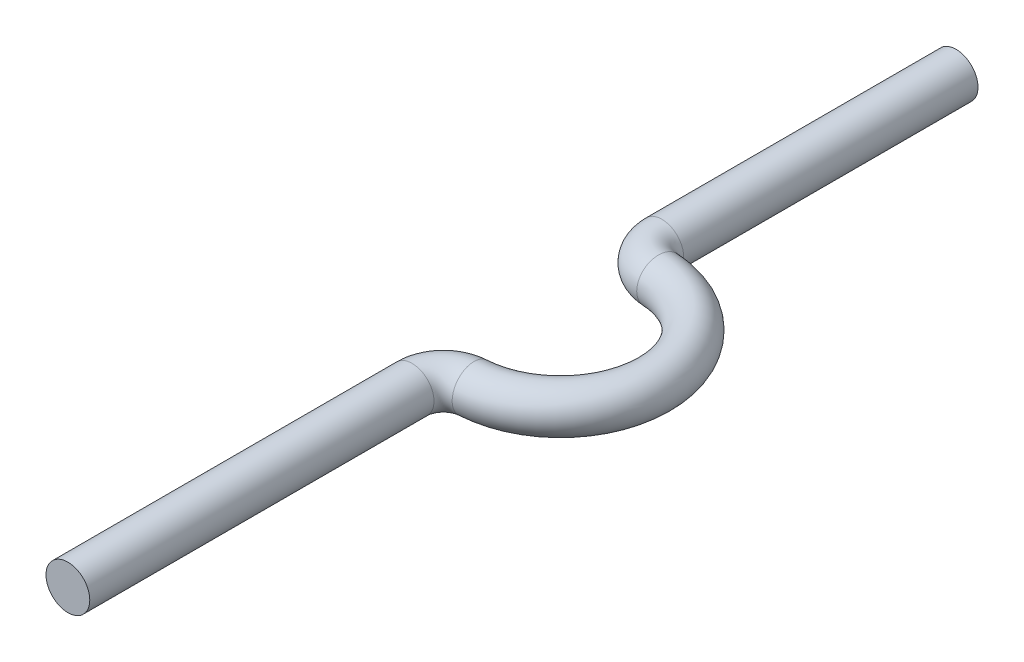
ISO-10303-21;
HEADER;
FILE_DESCRIPTION(('STEP AP214'),'2;1');
FILE_NAME('part.step','',(''),(''),'','','');
FILE_SCHEMA(('AUTOMOTIVE_DESIGN { 1 0 10303 214 1 1 1 1 }'));
ENDSEC;
DATA;
#1=APPLICATION_CONTEXT('core data for automotive mechanical design processes');
#2=APPLICATION_PROTOCOL_DEFINITION('international standard','automotive_design',2000,#1);
#3=PRODUCT_CONTEXT('',#1,'mechanical');
#4=PRODUCT('Part','Part','',(#3));
#5=PRODUCT_RELATED_PRODUCT_CATEGORY('part','',(#4));
#6=PRODUCT_DEFINITION_FORMATION('','',#4);
#7=PRODUCT_DEFINITION_CONTEXT('part definition',#1,'design');
#8=PRODUCT_DEFINITION('design','',#6,#7);
#9=PRODUCT_DEFINITION_SHAPE('','',#8);
#10=(LENGTH_UNIT() NAMED_UNIT(*) SI_UNIT(.MILLI.,.METRE.));
#11=(NAMED_UNIT(*) PLANE_ANGLE_UNIT() SI_UNIT($,.RADIAN.));
#12=(NAMED_UNIT(*) SI_UNIT($,.STERADIAN.) SOLID_ANGLE_UNIT());
#13=UNCERTAINTY_MEASURE_WITH_UNIT(LENGTH_MEASURE(1.E-05),#10,'distance_accuracy_value','');
#14=(GEOMETRIC_REPRESENTATION_CONTEXT(3) GLOBAL_UNCERTAINTY_ASSIGNED_CONTEXT((#13)) GLOBAL_UNIT_ASSIGNED_CONTEXT((#10,
#11,#12)) REPRESENTATION_CONTEXT('',''));
#15=CARTESIAN_POINT('',(0.,0.,0.));
#16=DIRECTION('',(0.,0.,1.));
#17=DIRECTION('',(1.,0.,0.));
#18=AXIS2_PLACEMENT_3D('',#15,#16,#17);
#19=CARTESIAN_POINT('',(0.,0.,0.));
#20=DIRECTION('',(0.,0.,1.));
#21=DIRECTION('',(1.,0.,0.));
#22=AXIS2_PLACEMENT_3D('',#19,#20,#21);
#23=PLANE('',#22);
#24=CARTESIAN_POINT('',(0.,0.,0.));
#25=DIRECTION('',(0.,0.,1.));
#26=DIRECTION('',(1.,0.,0.));
#27=AXIS2_PLACEMENT_3D('',#24,#25,#26);
#28=CIRCLE('',#27,3.5);
#29=CARTESIAN_POINT('',(3.5,0.,0.));
#30=VERTEX_POINT('',#29);
#31=EDGE_CURVE('E45',#30,#30,#28,.T.);
#32=ORIENTED_EDGE('',*,*,#31,.T.);
#33=EDGE_LOOP('',(#32));
#34=FACE_BOUND('',#33,.T.);
#35=ADVANCED_FACE('F33',(#34),#23,.T.);
#36=CARTESIAN_POINT('',(0.,0.,-142.));
#37=DIRECTION('',(0.,0.,1.));
#38=DIRECTION('',(1.,0.,0.));
#39=AXIS2_PLACEMENT_3D('',#36,#37,#38);
#40=PLANE('',#39);
#41=CARTESIAN_POINT('',(0.,0.,-142.));
#42=DIRECTION('',(0.,0.,1.));
#43=DIRECTION('',(1.,0.,0.));
#44=AXIS2_PLACEMENT_3D('',#41,#42,#43);
#45=CIRCLE('',#44,3.5);
#46=CARTESIAN_POINT('',(3.5,0.,-142.));
#47=VERTEX_POINT('',#46);
#48=EDGE_CURVE('E11',#47,#47,#45,.T.);
#49=ORIENTED_EDGE('',*,*,#48,.F.);
#50=EDGE_LOOP('',(#49));
#51=FACE_BOUND('',#50,.T.);
#52=ADVANCED_FACE('F51',(#51),#40,.F.);
#53=CARTESIAN_POINT('',(0.,0.,0.));
#54=DIRECTION('',(0.,0.,-1.));
#55=DIRECTION('',(-1.,0.,0.));
#56=AXIS2_PLACEMENT_3D('',#53,#54,#55);
#57=CYLINDRICAL_SURFACE('',#56,3.5);
#58=CARTESIAN_POINT('',(0.,0.,-55.0312805773287));
#59=DIRECTION('',(0.,0.,1.));
#60=DIRECTION('',(1.,0.,0.));
#61=AXIS2_PLACEMENT_3D('',#58,#59,#60);
#62=CIRCLE('',#61,3.5);
#63=CARTESIAN_POINT('',(-3.5,0.,-55.0312805773287));
#64=VERTEX_POINT('',#63);
#65=EDGE_CURVE('E85',#64,#64,#62,.T.);
#66=ORIENTED_EDGE('',*,*,#65,.T.);
#67=EDGE_LOOP('',(#66));
#68=FACE_BOUND('',#67,.T.);
#69=ORIENTED_EDGE('',*,*,#31,.F.);
#70=EDGE_LOOP('',(#69));
#71=FACE_BOUND('',#70,.T.);
#72=ADVANCED_FACE('F53',(#68,#71),#57,.T.);
#73=CARTESIAN_POINT('',(5.,0.,-55.0312805773287));
#74=DIRECTION('',(0.,-1.,0.));
#75=DIRECTION('',(0.,0.,-1.));
#76=AXIS2_PLACEMENT_3D('',#73,#74,#75);
#77=TOROIDAL_SURFACE('',#76,5.,3.5);
#78=CARTESIAN_POINT('',(4.6875,0.,-60.0215053969135));
#79=DIRECTION('',(-0.998044963916957,0.,0.0624999999999997));
#80=DIRECTION('',(0.0624999999999997,0.,0.998044963916957));
#81=AXIS2_PLACEMENT_3D('',#78,#79,#80);
#82=CIRCLE('',#81,3.5);
#83=CARTESIAN_POINT('',(4.46875,0.,-63.5146627706228));
#84=VERTEX_POINT('',#83);
#85=EDGE_CURVE('E82',#84,#84,#82,.T.);
#86=CARTESIAN_POINT('',(5.,0.,-55.0312805773287));
#87=DIRECTION('',(0.,-1.,0.));
#88=DIRECTION('',(0.,0.,-1.));
#89=AXIS2_PLACEMENT_3D('',#86,#87,#88);
#90=CIRCLE('',#89,8.5);
#91=EDGE_CURVE('',#64,#84,#90,.T.);
#92=ORIENTED_EDGE('',*,*,#65,.F.);
#93=ORIENTED_EDGE('',*,*,#85,.T.);
#94=ORIENTED_EDGE('',*,*,#91,.T.);
#95=ORIENTED_EDGE('',*,*,#91,.F.);
#96=EDGE_LOOP('',(#92,#94,#93,#95));
#97=FACE_BOUND('',#96,.T.);
#98=ADVANCED_FACE('F58',(#97),#77,.T.);
#99=CARTESIAN_POINT('',(3.75,0.,-74.9921798556678));
#100=DIRECTION('',(0.,1.,0.));
#101=DIRECTION('',(0.,0.,1.));
#102=AXIS2_PLACEMENT_3D('',#99,#100,#101);
#103=TOROIDAL_SURFACE('',#102,15.,3.5);
#104=CARTESIAN_POINT('',(4.6875,0.,-89.9628543144222));
#105=DIRECTION('',(0.998044963916957,0.,0.0625000000000002));
#106=DIRECTION('',(0.0625000000000002,0.,-0.998044963916957));
#107=AXIS2_PLACEMENT_3D('',#104,#105,#106);
#108=CIRCLE('',#107,3.5);
#109=CARTESIAN_POINT('',(4.46875000000001,0.,-86.4696969407128));
#110=VERTEX_POINT('',#109);
#111=EDGE_CURVE('E87',#110,#110,#108,.T.);
#112=ORIENTED_EDGE('',*,*,#111,.T.);
#113=EDGE_LOOP('',(#112));
#114=FACE_BOUND('',#113,.T.);
#115=ORIENTED_EDGE('',*,*,#85,.F.);
#116=EDGE_LOOP('',(#115));
#117=FACE_BOUND('',#116,.T.);
#118=ADVANCED_FACE('F68',(#114,#117),#103,.T.);
#119=CARTESIAN_POINT('',(5.,0.,-94.953079134007));
#120=DIRECTION('',(0.,-1.,0.));
#121=DIRECTION('',(0.,0.,-1.));
#122=AXIS2_PLACEMENT_3D('',#119,#120,#121);
#123=TOROIDAL_SURFACE('',#122,4.99999999999999,3.5);
#124=CARTESIAN_POINT('',(0.,0.,-94.953079134007));
#125=DIRECTION('',(0.,0.,1.));
#126=DIRECTION('',(1.,0.,0.));
#127=AXIS2_PLACEMENT_3D('',#124,#125,#126);
#128=CIRCLE('',#127,3.5);
#129=CARTESIAN_POINT('',(-3.49999999999999,0.,-94.953079134007));
#130=VERTEX_POINT('',#129);
#131=EDGE_CURVE('E40',#130,#130,#128,.T.);
#132=CARTESIAN_POINT('',(5.,0.,-94.953079134007));
#133=DIRECTION('',(0.,-1.,0.));
#134=DIRECTION('',(0.,0.,-1.));
#135=AXIS2_PLACEMENT_3D('',#132,#133,#134);
#136=CIRCLE('',#135,8.49999999999999);
#137=EDGE_CURVE('',#110,#130,#136,.T.);
#138=ORIENTED_EDGE('',*,*,#111,.F.);
#139=ORIENTED_EDGE('',*,*,#131,.T.);
#140=ORIENTED_EDGE('',*,*,#137,.T.);
#141=ORIENTED_EDGE('',*,*,#137,.F.);
#142=EDGE_LOOP('',(#138,#140,#139,#141));
#143=FACE_BOUND('',#142,.T.);
#144=ADVANCED_FACE('F64',(#143),#123,.T.);
#145=CARTESIAN_POINT('',(0.,0.,-94.953079134007));
#146=DIRECTION('',(0.,0.,-1.));
#147=DIRECTION('',(-1.,0.,0.));
#148=AXIS2_PLACEMENT_3D('',#145,#146,#147);
#149=CYLINDRICAL_SURFACE('',#148,3.5);
#150=ORIENTED_EDGE('',*,*,#48,.T.);
#151=EDGE_LOOP('',(#150));
#152=FACE_BOUND('',#151,.T.);
#153=ORIENTED_EDGE('',*,*,#131,.F.);
#154=EDGE_LOOP('',(#153));
#155=FACE_BOUND('',#154,.T.);
#156=ADVANCED_FACE('F48',(#152,#155),#149,.T.);
#157=CLOSED_SHELL('',(#35,#52,#72,#98,#118,#144,#156));
#158=MANIFOLD_SOLID_BREP('B2',#157);
#159=ADVANCED_BREP_SHAPE_REPRESENTATION('',(#18,#158),#14);
#160=SHAPE_DEFINITION_REPRESENTATION(#9,#159);
ENDSEC;
END-ISO-10303-21;
